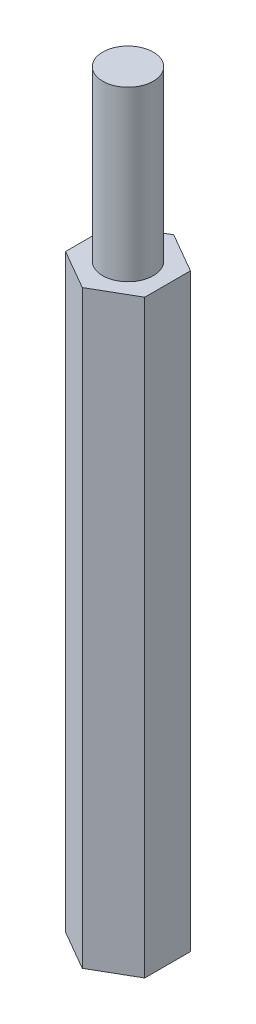
ISO-10303-21;
HEADER;
FILE_DESCRIPTION(('STEP AP214'),'2;1');
FILE_NAME('part.step','',(''),(''),'','','');
FILE_SCHEMA(('AUTOMOTIVE_DESIGN { 1 0 10303 214 1 1 1 1 }'));
ENDSEC;
DATA;
#1=APPLICATION_CONTEXT('core data for automotive mechanical design processes');
#2=APPLICATION_PROTOCOL_DEFINITION('international standard','automotive_design',2000,#1);
#3=PRODUCT_CONTEXT('',#1,'mechanical');
#4=PRODUCT('Part','Part','',(#3));
#5=PRODUCT_RELATED_PRODUCT_CATEGORY('part','',(#4));
#6=PRODUCT_DEFINITION_FORMATION('','',#4);
#7=PRODUCT_DEFINITION_CONTEXT('part definition',#1,'design');
#8=PRODUCT_DEFINITION('design','',#6,#7);
#9=PRODUCT_DEFINITION_SHAPE('','',#8);
#10=(LENGTH_UNIT() NAMED_UNIT(*) SI_UNIT(.MILLI.,.METRE.));
#11=(NAMED_UNIT(*) PLANE_ANGLE_UNIT() SI_UNIT($,.RADIAN.));
#12=(NAMED_UNIT(*) SI_UNIT($,.STERADIAN.) SOLID_ANGLE_UNIT());
#13=UNCERTAINTY_MEASURE_WITH_UNIT(LENGTH_MEASURE(1.E-05),#10,'distance_accuracy_value','');
#14=(GEOMETRIC_REPRESENTATION_CONTEXT(3) GLOBAL_UNCERTAINTY_ASSIGNED_CONTEXT((#13)) GLOBAL_UNIT_ASSIGNED_CONTEXT((#10,
#11,#12)) REPRESENTATION_CONTEXT('',''));
#15=CARTESIAN_POINT('',(0.,0.,0.));
#16=DIRECTION('',(0.,0.,1.));
#17=DIRECTION('',(1.,0.,0.));
#18=AXIS2_PLACEMENT_3D('',#15,#16,#17);
#19=CARTESIAN_POINT('',(2.34999999999999,35.,-1.35677313259565));
#20=DIRECTION('',(-0.499999999999995,0.,0.866025403784441));
#21=DIRECTION('',(0.866025403784441,0.,0.499999999999995));
#22=AXIS2_PLACEMENT_3D('',#19,#20,#21);
#23=PLANE('',#22);
#24=DIRECTION('',(-0.866025403784441,0.,-0.499999999999995));
#25=VECTOR('',#24,1.);
#26=CARTESIAN_POINT('',(2.34999999999999,0.,-1.35677313259565));
#27=LINE('',#26,#25);
#28=CARTESIAN_POINT('',(2.34999999999999,0.,-1.35677313259565));
#29=VERTEX_POINT('',#28);
#30=CARTESIAN_POINT('',(0.,0.,-2.71354626519124));
#31=VERTEX_POINT('',#30);
#32=EDGE_CURVE('E130',#29,#31,#27,.T.);
#33=ORIENTED_EDGE('',*,*,#32,.T.);
#34=DIRECTION('',(0.,-1.,0.));
#35=VECTOR('',#34,1.);
#36=CARTESIAN_POINT('',(0.,35.,-2.71354626519124));
#37=LINE('',#36,#35);
#38=CARTESIAN_POINT('',(0.,35.,-2.71354626519124));
#39=VERTEX_POINT('',#38);
#40=EDGE_CURVE('E42',#39,#31,#37,.T.);
#41=ORIENTED_EDGE('',*,*,#40,.F.);
#42=DIRECTION('',(-0.866025403784441,0.,-0.499999999999995));
#43=VECTOR('',#42,1.);
#44=CARTESIAN_POINT('',(2.34999999999999,35.,-1.35677313259565));
#45=LINE('',#44,#43);
#46=CARTESIAN_POINT('',(2.34999999999999,35.,-1.35677313259565));
#47=VERTEX_POINT('',#46);
#48=EDGE_CURVE('E147',#47,#39,#45,.T.);
#49=ORIENTED_EDGE('',*,*,#48,.F.);
#50=DIRECTION('',(0.,-1.,0.));
#51=VECTOR('',#50,1.);
#52=CARTESIAN_POINT('',(2.34999999999999,35.,-1.35677313259565));
#53=LINE('',#52,#51);
#54=EDGE_CURVE('E126',#47,#29,#53,.T.);
#55=ORIENTED_EDGE('',*,*,#54,.T.);
#56=EDGE_LOOP('',(#33,#41,#49,#55));
#57=FACE_BOUND('',#56,.T.);
#58=ADVANCED_FACE('F39',(#57),#23,.F.);
#59=CARTESIAN_POINT('',(0.,35.,-2.71354626519124));
#60=DIRECTION('',(0.500000000000001,0.,0.866025403784438));
#61=DIRECTION('',(0.866025403784438,0.,-0.500000000000001));
#62=AXIS2_PLACEMENT_3D('',#59,#60,#61);
#63=PLANE('',#62);
#64=DIRECTION('',(-0.866025403784438,0.,0.500000000000001));
#65=VECTOR('',#64,1.);
#66=CARTESIAN_POINT('',(0.,0.,-2.71354626519124));
#67=LINE('',#66,#65);
#68=CARTESIAN_POINT('',(-2.35,0.,-1.35677313259562));
#69=VERTEX_POINT('',#68);
#70=EDGE_CURVE('E134',#31,#69,#67,.T.);
#71=ORIENTED_EDGE('',*,*,#70,.T.);
#72=DIRECTION('',(0.,-1.,0.));
#73=VECTOR('',#72,1.);
#74=CARTESIAN_POINT('',(-2.35,35.,-1.35677313259562));
#75=LINE('',#74,#73);
#76=CARTESIAN_POINT('',(-2.35,35.,-1.35677313259562));
#77=VERTEX_POINT('',#76);
#78=EDGE_CURVE('E153',#77,#69,#75,.T.);
#79=ORIENTED_EDGE('',*,*,#78,.F.);
#80=DIRECTION('',(-0.866025403784438,0.,0.500000000000001));
#81=VECTOR('',#80,1.);
#82=CARTESIAN_POINT('',(0.,35.,-2.71354626519124));
#83=LINE('',#82,#81);
#84=EDGE_CURVE('E95',#39,#77,#83,.T.);
#85=ORIENTED_EDGE('',*,*,#84,.F.);
#86=ORIENTED_EDGE('',*,*,#40,.T.);
#87=EDGE_LOOP('',(#71,#79,#85,#86));
#88=FACE_BOUND('',#87,.T.);
#89=ADVANCED_FACE('F160',(#88),#63,.F.);
#90=CARTESIAN_POINT('',(-2.35,35.,-1.35677313259562));
#91=DIRECTION('',(1.,0.,0.));
#92=DIRECTION('',(0.,0.,-1.));
#93=AXIS2_PLACEMENT_3D('',#90,#91,#92);
#94=PLANE('',#93);
#95=DIRECTION('',(0.,0.,1.));
#96=VECTOR('',#95,1.);
#97=CARTESIAN_POINT('',(-2.35,0.,-1.35677313259562));
#98=LINE('',#97,#96);
#99=CARTESIAN_POINT('',(-2.35,0.,1.35677313259563));
#100=VERTEX_POINT('',#99);
#101=EDGE_CURVE('E138',#69,#100,#98,.T.);
#102=ORIENTED_EDGE('',*,*,#101,.T.);
#103=DIRECTION('',(0.,-1.,0.));
#104=VECTOR('',#103,1.);
#105=CARTESIAN_POINT('',(-2.35,35.,1.35677313259563));
#106=LINE('',#105,#104);
#107=CARTESIAN_POINT('',(-2.35,35.,1.35677313259563));
#108=VERTEX_POINT('',#107);
#109=EDGE_CURVE('E119',#108,#100,#106,.T.);
#110=ORIENTED_EDGE('',*,*,#109,.F.);
#111=DIRECTION('',(0.,0.,1.));
#112=VECTOR('',#111,1.);
#113=CARTESIAN_POINT('',(-2.35,35.,-1.35677313259562));
#114=LINE('',#113,#112);
#115=EDGE_CURVE('E108',#77,#108,#114,.T.);
#116=ORIENTED_EDGE('',*,*,#115,.F.);
#117=ORIENTED_EDGE('',*,*,#78,.T.);
#118=EDGE_LOOP('',(#102,#110,#116,#117));
#119=FACE_BOUND('',#118,.T.);
#120=ADVANCED_FACE('F166',(#119),#94,.F.);
#121=CARTESIAN_POINT('',(-2.35,35.,1.35677313259563));
#122=DIRECTION('',(0.499999999999995,0.,-0.866025403784442));
#123=DIRECTION('',(-0.866025403784442,0.,-0.499999999999995));
#124=AXIS2_PLACEMENT_3D('',#121,#122,#123);
#125=PLANE('',#124);
#126=DIRECTION('',(0.866025403784442,0.,0.499999999999995));
#127=VECTOR('',#126,1.);
#128=CARTESIAN_POINT('',(-2.35,0.,1.35677313259563));
#129=LINE('',#128,#127);
#130=CARTESIAN_POINT('',(0.,0.,2.71354626519124));
#131=VERTEX_POINT('',#130);
#132=EDGE_CURVE('E117',#100,#131,#129,.T.);
#133=ORIENTED_EDGE('',*,*,#132,.T.);
#134=DIRECTION('',(0.,-1.,0.));
#135=VECTOR('',#134,1.);
#136=CARTESIAN_POINT('',(0.,35.,2.71354626519124));
#137=LINE('',#136,#135);
#138=CARTESIAN_POINT('',(0.,35.,2.71354626519124));
#139=VERTEX_POINT('',#138);
#140=EDGE_CURVE('E114',#139,#131,#137,.T.);
#141=ORIENTED_EDGE('',*,*,#140,.F.);
#142=DIRECTION('',(0.866025403784442,0.,0.499999999999995));
#143=VECTOR('',#142,1.);
#144=CARTESIAN_POINT('',(-2.35,35.,1.35677313259563));
#145=LINE('',#144,#143);
#146=EDGE_CURVE('E102',#108,#139,#145,.T.);
#147=ORIENTED_EDGE('',*,*,#146,.F.);
#148=ORIENTED_EDGE('',*,*,#109,.T.);
#149=EDGE_LOOP('',(#133,#141,#147,#148));
#150=FACE_BOUND('',#149,.T.);
#151=ADVANCED_FACE('F115',(#150),#125,.F.);
#152=CARTESIAN_POINT('',(0.,35.,2.71354626519124));
#153=DIRECTION('',(-0.500000000000007,0.,-0.866025403784434));
#154=DIRECTION('',(-0.866025403784435,0.,0.500000000000007));
#155=AXIS2_PLACEMENT_3D('',#152,#153,#154);
#156=PLANE('',#155);
#157=DIRECTION('',(0.866025403784435,0.,-0.500000000000007));
#158=VECTOR('',#157,1.);
#159=CARTESIAN_POINT('',(0.,0.,2.71354626519124));
#160=LINE('',#159,#158);
#161=CARTESIAN_POINT('',(2.35000000000001,0.,1.3567731325956));
#162=VERTEX_POINT('',#161);
#163=EDGE_CURVE('E80',#131,#162,#160,.T.);
#164=ORIENTED_EDGE('',*,*,#163,.T.);
#165=DIRECTION('',(0.,-1.,0.));
#166=VECTOR('',#165,1.);
#167=CARTESIAN_POINT('',(2.35000000000001,35.,1.3567731325956));
#168=LINE('',#167,#166);
#169=CARTESIAN_POINT('',(2.35000000000001,35.,1.3567731325956));
#170=VERTEX_POINT('',#169);
#171=EDGE_CURVE('E120',#170,#162,#168,.T.);
#172=ORIENTED_EDGE('',*,*,#171,.F.);
#173=DIRECTION('',(0.866025403784435,0.,-0.500000000000007));
#174=VECTOR('',#173,1.);
#175=CARTESIAN_POINT('',(0.,35.,2.71354626519124));
#176=LINE('',#175,#174);
#177=EDGE_CURVE('E106',#139,#170,#176,.T.);
#178=ORIENTED_EDGE('',*,*,#177,.F.);
#179=ORIENTED_EDGE('',*,*,#140,.T.);
#180=EDGE_LOOP('',(#164,#172,#178,#179));
#181=FACE_BOUND('',#180,.T.);
#182=ADVANCED_FACE('F122',(#181),#156,.F.);
#183=CARTESIAN_POINT('',(2.35000000000001,35.,1.3567731325956));
#184=DIRECTION('',(-1.,0.,0.));
#185=DIRECTION('',(0.,0.,1.));
#186=AXIS2_PLACEMENT_3D('',#183,#184,#185);
#187=PLANE('',#186);
#188=DIRECTION('',(0.,0.,-1.));
#189=VECTOR('',#188,1.);
#190=CARTESIAN_POINT('',(2.35000000000001,0.,1.3567731325956));
#191=LINE('',#190,#189);
#192=EDGE_CURVE('E86',#162,#29,#191,.T.);
#193=ORIENTED_EDGE('',*,*,#192,.T.);
#194=ORIENTED_EDGE('',*,*,#54,.F.);
#195=DIRECTION('',(0.,0.,-1.));
#196=VECTOR('',#195,1.);
#197=CARTESIAN_POINT('',(2.35000000000001,35.,1.3567731325956));
#198=LINE('',#197,#196);
#199=EDGE_CURVE('E57',#170,#47,#198,.T.);
#200=ORIENTED_EDGE('',*,*,#199,.F.);
#201=ORIENTED_EDGE('',*,*,#171,.T.);
#202=EDGE_LOOP('',(#193,#194,#200,#201));
#203=FACE_BOUND('',#202,.T.);
#204=ADVANCED_FACE('F203',(#203),#187,.F.);
#205=CARTESIAN_POINT('',(0.,35.,0.));
#206=DIRECTION('',(0.,1.,0.));
#207=DIRECTION('',(0.,0.,1.));
#208=AXIS2_PLACEMENT_3D('',#205,#206,#207);
#209=PLANE('',#208);
#210=CARTESIAN_POINT('',(0.,35.,0.));
#211=DIRECTION('',(0.,1.,0.));
#212=DIRECTION('',(0.,0.,1.));
#213=AXIS2_PLACEMENT_3D('',#210,#211,#212);
#214=CIRCLE('',#213,1.5);
#215=CARTESIAN_POINT('',(0.,35.,1.5));
#216=VERTEX_POINT('',#215);
#217=EDGE_CURVE('E11',#216,#216,#214,.T.);
#218=ORIENTED_EDGE('',*,*,#217,.F.);
#219=EDGE_LOOP('',(#218));
#220=FACE_BOUND('',#219,.T.);
#221=ORIENTED_EDGE('',*,*,#48,.T.);
#222=ORIENTED_EDGE('',*,*,#84,.T.);
#223=ORIENTED_EDGE('',*,*,#115,.T.);
#224=ORIENTED_EDGE('',*,*,#146,.T.);
#225=ORIENTED_EDGE('',*,*,#177,.T.);
#226=ORIENTED_EDGE('',*,*,#199,.T.);
#227=EDGE_LOOP('',(#221,#222,#223,#224,#225,#226));
#228=FACE_BOUND('',#227,.T.);
#229=ADVANCED_FACE('F104',(#220,#228),#209,.T.);
#230=CARTESIAN_POINT('',(0.,0.,0.));
#231=DIRECTION('',(0.,1.,0.));
#232=DIRECTION('',(0.,0.,1.));
#233=AXIS2_PLACEMENT_3D('',#230,#231,#232);
#234=PLANE('',#233);
#235=CARTESIAN_POINT('',(0.,0.,0.));
#236=DIRECTION('',(0.,-1.,0.));
#237=DIRECTION('',(0.,0.,-1.));
#238=AXIS2_PLACEMENT_3D('',#235,#236,#237);
#239=CIRCLE('',#238,1.5);
#240=CARTESIAN_POINT('',(0.,0.,-1.5));
#241=VERTEX_POINT('',#240);
#242=EDGE_CURVE('E177',#241,#241,#239,.T.);
#243=ORIENTED_EDGE('',*,*,#242,.F.);
#244=EDGE_LOOP('',(#243));
#245=FACE_BOUND('',#244,.T.);
#246=ORIENTED_EDGE('',*,*,#32,.F.);
#247=ORIENTED_EDGE('',*,*,#192,.F.);
#248=ORIENTED_EDGE('',*,*,#163,.F.);
#249=ORIENTED_EDGE('',*,*,#132,.F.);
#250=ORIENTED_EDGE('',*,*,#101,.F.);
#251=ORIENTED_EDGE('',*,*,#70,.F.);
#252=EDGE_LOOP('',(#246,#247,#248,#249,#250,#251));
#253=FACE_BOUND('',#252,.T.);
#254=ADVANCED_FACE('F165',(#245,#253),#234,.F.);
#255=CARTESIAN_POINT('',(0.,45.,0.));
#256=DIRECTION('',(0.,-1.,0.));
#257=DIRECTION('',(0.,0.,-1.));
#258=AXIS2_PLACEMENT_3D('',#255,#256,#257);
#259=CYLINDRICAL_SURFACE('',#258,1.5);
#260=CARTESIAN_POINT('',(0.,45.,0.));
#261=DIRECTION('',(0.,1.,0.));
#262=DIRECTION('',(0.,0.,1.));
#263=AXIS2_PLACEMENT_3D('',#260,#261,#262);
#264=CIRCLE('',#263,1.5);
#265=CARTESIAN_POINT('',(0.,45.,1.5));
#266=VERTEX_POINT('',#265);
#267=EDGE_CURVE('E135',#266,#266,#264,.T.);
#268=ORIENTED_EDGE('',*,*,#267,.F.);
#269=EDGE_LOOP('',(#268));
#270=FACE_BOUND('',#269,.T.);
#271=ORIENTED_EDGE('',*,*,#217,.T.);
#272=EDGE_LOOP('',(#271));
#273=FACE_BOUND('',#272,.T.);
#274=ADVANCED_FACE('F195',(#270,#273),#259,.T.);
#275=CARTESIAN_POINT('',(0.,45.,0.));
#276=DIRECTION('',(0.,1.,0.));
#277=DIRECTION('',(0.,0.,1.));
#278=AXIS2_PLACEMENT_3D('',#275,#276,#277);
#279=PLANE('',#278);
#280=ORIENTED_EDGE('',*,*,#267,.T.);
#281=EDGE_LOOP('',(#280));
#282=FACE_BOUND('',#281,.T.);
#283=ADVANCED_FACE('F190',(#282),#279,.T.);
#284=CARTESIAN_POINT('',(0.,10.,0.));
#285=DIRECTION('',(0.,-1.,0.));
#286=DIRECTION('',(0.,0.,-1.));
#287=AXIS2_PLACEMENT_3D('',#284,#285,#286);
#288=CYLINDRICAL_SURFACE('',#287,1.5);
#289=CARTESIAN_POINT('',(0.,10.,0.));
#290=DIRECTION('',(0.,-1.,0.));
#291=DIRECTION('',(0.,0.,-1.));
#292=AXIS2_PLACEMENT_3D('',#289,#290,#291);
#293=CIRCLE('',#292,1.5);
#294=CARTESIAN_POINT('',(0.,10.,-1.5));
#295=VERTEX_POINT('',#294);
#296=EDGE_CURVE('E176',#295,#295,#293,.T.);
#297=ORIENTED_EDGE('',*,*,#296,.F.);
#298=EDGE_LOOP('',(#297));
#299=FACE_BOUND('',#298,.T.);
#300=ORIENTED_EDGE('',*,*,#242,.T.);
#301=EDGE_LOOP('',(#300));
#302=FACE_BOUND('',#301,.T.);
#303=ADVANCED_FACE('F187',(#299,#302),#288,.F.);
#304=CARTESIAN_POINT('',(0.,10.,0.));
#305=DIRECTION('',(0.,-1.,0.));
#306=DIRECTION('',(0.,0.,-1.));
#307=AXIS2_PLACEMENT_3D('',#304,#305,#306);
#308=PLANE('',#307);
#309=ORIENTED_EDGE('',*,*,#296,.T.);
#310=EDGE_LOOP('',(#309));
#311=FACE_BOUND('',#310,.T.);
#312=ADVANCED_FACE('F185',(#311),#308,.T.);
#313=CLOSED_SHELL('',(#58,#89,#120,#151,#182,#204,#229,#254,#274,#283,#303,#312));
#314=MANIFOLD_SOLID_BREP('B2',#313);
#315=ADVANCED_BREP_SHAPE_REPRESENTATION('',(#18,#314),#14);
#316=SHAPE_DEFINITION_REPRESENTATION(#9,#315);
ENDSEC;
END-ISO-10303-21;
